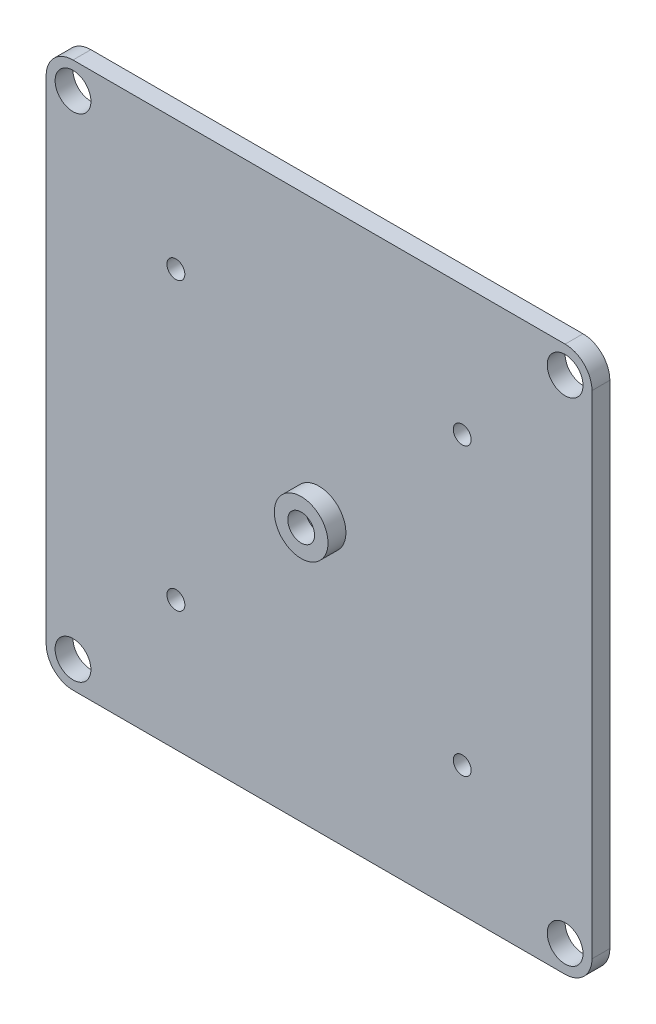
ISO-10303-21;
HEADER;
FILE_DESCRIPTION(('STEP AP214'),'2;1');
FILE_NAME('part.step','',(''),(''),'','','');
FILE_SCHEMA(('AUTOMOTIVE_DESIGN { 1 0 10303 214 1 1 1 1 }'));
ENDSEC;
DATA;
#1=APPLICATION_CONTEXT('core data for automotive mechanical design processes');
#2=APPLICATION_PROTOCOL_DEFINITION('international standard','automotive_design',2000,#1);
#3=PRODUCT_CONTEXT('',#1,'mechanical');
#4=PRODUCT('Part','Part','',(#3));
#5=PRODUCT_RELATED_PRODUCT_CATEGORY('part','',(#4));
#6=PRODUCT_DEFINITION_FORMATION('','',#4);
#7=PRODUCT_DEFINITION_CONTEXT('part definition',#1,'design');
#8=PRODUCT_DEFINITION('design','',#6,#7);
#9=PRODUCT_DEFINITION_SHAPE('','',#8);
#10=(LENGTH_UNIT() NAMED_UNIT(*) SI_UNIT(.MILLI.,.METRE.));
#11=(NAMED_UNIT(*) PLANE_ANGLE_UNIT() SI_UNIT($,.RADIAN.));
#12=(NAMED_UNIT(*) SI_UNIT($,.STERADIAN.) SOLID_ANGLE_UNIT());
#13=UNCERTAINTY_MEASURE_WITH_UNIT(LENGTH_MEASURE(1.E-05),#10,'distance_accuracy_value','');
#14=(GEOMETRIC_REPRESENTATION_CONTEXT(3) GLOBAL_UNCERTAINTY_ASSIGNED_CONTEXT((#13)) GLOBAL_UNIT_ASSIGNED_CONTEXT((#10,
#11,#12)) REPRESENTATION_CONTEXT('',''));
#15=CARTESIAN_POINT('',(0.,0.,0.));
#16=DIRECTION('',(0.,0.,1.));
#17=DIRECTION('',(1.,0.,0.));
#18=AXIS2_PLACEMENT_3D('',#15,#16,#17);
#19=CARTESIAN_POINT('',(-152.5,-152.5,10.));
#20=DIRECTION('',(1.,0.,0.));
#21=DIRECTION('',(0.,1.,0.));
#22=AXIS2_PLACEMENT_3D('',#19,#20,#21);
#23=PLANE('',#22);
#24=DIRECTION('',(0.,-1.,0.));
#25=VECTOR('',#24,1.);
#26=CARTESIAN_POINT('',(-152.5,-152.5,0.));
#27=LINE('',#26,#25);
#28=CARTESIAN_POINT('',(-152.5,137.5,0.));
#29=VERTEX_POINT('',#28);
#30=CARTESIAN_POINT('',(-152.5,-137.5,0.));
#31=VERTEX_POINT('',#30);
#32=EDGE_CURVE('E189',#29,#31,#27,.T.);
#33=ORIENTED_EDGE('',*,*,#32,.T.);
#34=DIRECTION('',(0.,0.,-1.));
#35=VECTOR('',#34,1.);
#36=CARTESIAN_POINT('',(-152.5,-137.5,10.));
#37=LINE('',#36,#35);
#38=CARTESIAN_POINT('',(-152.5,-137.5,10.));
#39=VERTEX_POINT('',#38);
#40=EDGE_CURVE('E50',#31,#39,#37,.F.);
#41=ORIENTED_EDGE('',*,*,#40,.T.);
#42=DIRECTION('',(0.,-1.,0.));
#43=VECTOR('',#42,1.);
#44=CARTESIAN_POINT('',(-152.5,-152.5,10.));
#45=LINE('',#44,#43);
#46=CARTESIAN_POINT('',(-152.5,137.5,10.));
#47=VERTEX_POINT('',#46);
#48=EDGE_CURVE('E138',#47,#39,#45,.T.);
#49=ORIENTED_EDGE('',*,*,#48,.F.);
#50=DIRECTION('',(0.,0.,-1.));
#51=VECTOR('',#50,1.);
#52=CARTESIAN_POINT('',(-152.5,137.5,10.));
#53=LINE('',#52,#51);
#54=EDGE_CURVE('E180',#47,#29,#53,.T.);
#55=ORIENTED_EDGE('',*,*,#54,.T.);
#56=EDGE_LOOP('',(#33,#41,#49,#55));
#57=FACE_BOUND('',#56,.T.);
#58=ADVANCED_FACE('F41',(#57),#23,.F.);
#59=CARTESIAN_POINT('',(-152.5,-152.5,10.));
#60=DIRECTION('',(0.,1.,0.));
#61=DIRECTION('',(0.,0.,1.));
#62=AXIS2_PLACEMENT_3D('',#59,#60,#61);
#63=PLANE('',#62);
#64=DIRECTION('',(1.,0.,0.));
#65=VECTOR('',#64,1.);
#66=CARTESIAN_POINT('',(-152.5,-152.5,0.));
#67=LINE('',#66,#65);
#68=CARTESIAN_POINT('',(-137.5,-152.5,0.));
#69=VERTEX_POINT('',#68);
#70=CARTESIAN_POINT('',(137.5,-152.5,0.));
#71=VERTEX_POINT('',#70);
#72=EDGE_CURVE('E145',#69,#71,#67,.T.);
#73=ORIENTED_EDGE('',*,*,#72,.T.);
#74=DIRECTION('',(0.,0.,-1.));
#75=VECTOR('',#74,1.);
#76=CARTESIAN_POINT('',(137.5,-152.5,10.));
#77=LINE('',#76,#75);
#78=CARTESIAN_POINT('',(137.5,-152.5,10.));
#79=VERTEX_POINT('',#78);
#80=EDGE_CURVE('E57',#71,#79,#77,.F.);
#81=ORIENTED_EDGE('',*,*,#80,.T.);
#82=DIRECTION('',(1.,0.,0.));
#83=VECTOR('',#82,1.);
#84=CARTESIAN_POINT('',(-152.5,-152.5,10.));
#85=LINE('',#84,#83);
#86=CARTESIAN_POINT('',(-137.5,-152.5,10.));
#87=VERTEX_POINT('',#86);
#88=EDGE_CURVE('E143',#87,#79,#85,.T.);
#89=ORIENTED_EDGE('',*,*,#88,.F.);
#90=DIRECTION('',(0.,0.,-1.));
#91=VECTOR('',#90,1.);
#92=CARTESIAN_POINT('',(-137.5,-152.5,10.));
#93=LINE('',#92,#91);
#94=EDGE_CURVE('E174',#87,#69,#93,.T.);
#95=ORIENTED_EDGE('',*,*,#94,.T.);
#96=EDGE_LOOP('',(#73,#81,#89,#95));
#97=FACE_BOUND('',#96,.T.);
#98=ADVANCED_FACE('F197',(#97),#63,.F.);
#99=CARTESIAN_POINT('',(152.5,-152.5,10.));
#100=DIRECTION('',(-1.,0.,0.));
#101=DIRECTION('',(0.,-1.,0.));
#102=AXIS2_PLACEMENT_3D('',#99,#100,#101);
#103=PLANE('',#102);
#104=DIRECTION('',(0.,1.,0.));
#105=VECTOR('',#104,1.);
#106=CARTESIAN_POINT('',(152.5,-152.5,0.));
#107=LINE('',#106,#105);
#108=CARTESIAN_POINT('',(152.5,-137.5,0.));
#109=VERTEX_POINT('',#108);
#110=CARTESIAN_POINT('',(152.5,137.5,0.));
#111=VERTEX_POINT('',#110);
#112=EDGE_CURVE('E139',#109,#111,#107,.T.);
#113=ORIENTED_EDGE('',*,*,#112,.T.);
#114=DIRECTION('',(0.,0.,-1.));
#115=VECTOR('',#114,1.);
#116=CARTESIAN_POINT('',(152.5,137.5,10.));
#117=LINE('',#116,#115);
#118=CARTESIAN_POINT('',(152.5,137.5,10.));
#119=VERTEX_POINT('',#118);
#120=EDGE_CURVE('E114',#111,#119,#117,.F.);
#121=ORIENTED_EDGE('',*,*,#120,.T.);
#122=DIRECTION('',(0.,1.,0.));
#123=VECTOR('',#122,1.);
#124=CARTESIAN_POINT('',(152.5,-152.5,10.));
#125=LINE('',#124,#123);
#126=CARTESIAN_POINT('',(152.5,-137.5,10.));
#127=VERTEX_POINT('',#126);
#128=EDGE_CURVE('E205',#127,#119,#125,.T.);
#129=ORIENTED_EDGE('',*,*,#128,.F.);
#130=DIRECTION('',(0.,0.,-1.));
#131=VECTOR('',#130,1.);
#132=CARTESIAN_POINT('',(152.5,-137.5,10.));
#133=LINE('',#132,#131);
#134=EDGE_CURVE('E120',#127,#109,#133,.T.);
#135=ORIENTED_EDGE('',*,*,#134,.T.);
#136=EDGE_LOOP('',(#113,#121,#129,#135));
#137=FACE_BOUND('',#136,.T.);
#138=ADVANCED_FACE('F347',(#137),#103,.F.);
#139=CARTESIAN_POINT('',(-152.5,152.5,10.));
#140=DIRECTION('',(0.,-1.,0.));
#141=DIRECTION('',(1.,0.,0.));
#142=AXIS2_PLACEMENT_3D('',#139,#140,#141);
#143=PLANE('',#142);
#144=DIRECTION('',(-1.,0.,0.));
#145=VECTOR('',#144,1.);
#146=CARTESIAN_POINT('',(-152.5,152.5,10.));
#147=LINE('',#146,#145);
#148=CARTESIAN_POINT('',(137.5,152.5,10.));
#149=VERTEX_POINT('',#148);
#150=CARTESIAN_POINT('',(-137.5,152.5,10.));
#151=VERTEX_POINT('',#150);
#152=EDGE_CURVE('E130',#149,#151,#147,.T.);
#153=ORIENTED_EDGE('',*,*,#152,.F.);
#154=DIRECTION('',(0.,0.,-1.));
#155=VECTOR('',#154,1.);
#156=CARTESIAN_POINT('',(137.5,152.5,10.));
#157=LINE('',#156,#155);
#158=CARTESIAN_POINT('',(137.5,152.5,0.));
#159=VERTEX_POINT('',#158);
#160=EDGE_CURVE('E113',#149,#159,#157,.T.);
#161=ORIENTED_EDGE('',*,*,#160,.T.);
#162=DIRECTION('',(-1.,0.,0.));
#163=VECTOR('',#162,1.);
#164=CARTESIAN_POINT('',(-152.5,152.5,0.));
#165=LINE('',#164,#163);
#166=CARTESIAN_POINT('',(-137.5,152.5,0.));
#167=VERTEX_POINT('',#166);
#168=EDGE_CURVE('E127',#159,#167,#165,.T.);
#169=ORIENTED_EDGE('',*,*,#168,.T.);
#170=DIRECTION('',(0.,0.,-1.));
#171=VECTOR('',#170,1.);
#172=CARTESIAN_POINT('',(-137.5,152.5,10.));
#173=LINE('',#172,#171);
#174=EDGE_CURVE('E133',#167,#151,#173,.F.);
#175=ORIENTED_EDGE('',*,*,#174,.T.);
#176=EDGE_LOOP('',(#153,#161,#169,#175));
#177=FACE_BOUND('',#176,.T.);
#178=ADVANCED_FACE('F126',(#177),#143,.F.);
#179=CARTESIAN_POINT('',(0.,0.,10.));
#180=DIRECTION('',(0.,0.,-1.));
#181=DIRECTION('',(-1.,0.,0.));
#182=AXIS2_PLACEMENT_3D('',#179,#180,#181);
#183=PLANE('',#182);
#184=CARTESIAN_POINT('',(0.,0.,10.));
#185=DIRECTION('',(0.,0.,-1.));
#186=DIRECTION('',(-1.,0.,0.));
#187=AXIS2_PLACEMENT_3D('',#184,#185,#186);
#188=CIRCLE('',#187,15.);
#189=CARTESIAN_POINT('',(-15.,0.,10.));
#190=VERTEX_POINT('',#189);
#191=EDGE_CURVE('E11',#190,#190,#188,.F.);
#192=ORIENTED_EDGE('',*,*,#191,.F.);
#193=EDGE_LOOP('',(#192));
#194=FACE_BOUND('',#193,.T.);
#195=CARTESIAN_POINT('',(-80.,80.,10.));
#196=DIRECTION('',(0.,0.,1.));
#197=DIRECTION('',(1.,0.,0.));
#198=AXIS2_PLACEMENT_3D('',#195,#196,#197);
#199=CIRCLE('',#198,5.00000000000001);
#200=CARTESIAN_POINT('',(-75.,80.,10.));
#201=VERTEX_POINT('',#200);
#202=EDGE_CURVE('E250',#201,#201,#199,.T.);
#203=ORIENTED_EDGE('',*,*,#202,.F.);
#204=EDGE_LOOP('',(#203));
#205=FACE_BOUND('',#204,.T.);
#206=CARTESIAN_POINT('',(-80.,-80.,10.));
#207=DIRECTION('',(0.,0.,1.));
#208=DIRECTION('',(1.,0.,0.));
#209=AXIS2_PLACEMENT_3D('',#206,#207,#208);
#210=CIRCLE('',#209,5.00000000000001);
#211=CARTESIAN_POINT('',(-75.,-80.,10.));
#212=VERTEX_POINT('',#211);
#213=EDGE_CURVE('E259',#212,#212,#210,.T.);
#214=ORIENTED_EDGE('',*,*,#213,.F.);
#215=EDGE_LOOP('',(#214));
#216=FACE_BOUND('',#215,.T.);
#217=CARTESIAN_POINT('',(80.,-80.,10.));
#218=DIRECTION('',(0.,0.,1.));
#219=DIRECTION('',(1.,0.,0.));
#220=AXIS2_PLACEMENT_3D('',#217,#218,#219);
#221=CIRCLE('',#220,5.00000000000001);
#222=CARTESIAN_POINT('',(85.,-80.,10.));
#223=VERTEX_POINT('',#222);
#224=EDGE_CURVE('E267',#223,#223,#221,.T.);
#225=ORIENTED_EDGE('',*,*,#224,.F.);
#226=EDGE_LOOP('',(#225));
#227=FACE_BOUND('',#226,.T.);
#228=CARTESIAN_POINT('',(80.,80.,10.));
#229=DIRECTION('',(0.,0.,1.));
#230=DIRECTION('',(1.,0.,0.));
#231=AXIS2_PLACEMENT_3D('',#228,#229,#230);
#232=CIRCLE('',#231,5.00000000000001);
#233=CARTESIAN_POINT('',(85.,80.,10.));
#234=VERTEX_POINT('',#233);
#235=EDGE_CURVE('E242',#234,#234,#232,.T.);
#236=ORIENTED_EDGE('',*,*,#235,.F.);
#237=EDGE_LOOP('',(#236));
#238=FACE_BOUND('',#237,.T.);
#239=CARTESIAN_POINT('',(-137.5,137.5,10.));
#240=DIRECTION('',(0.,0.,1.));
#241=DIRECTION('',(1.,0.,0.));
#242=AXIS2_PLACEMENT_3D('',#239,#240,#241);
#243=CIRCLE('',#242,10.);
#244=CARTESIAN_POINT('',(-127.5,137.5,10.));
#245=VERTEX_POINT('',#244);
#246=EDGE_CURVE('E218',#245,#245,#243,.T.);
#247=ORIENTED_EDGE('',*,*,#246,.F.);
#248=EDGE_LOOP('',(#247));
#249=FACE_BOUND('',#248,.T.);
#250=CARTESIAN_POINT('',(-137.5,-137.5,10.));
#251=DIRECTION('',(0.,0.,1.));
#252=DIRECTION('',(1.,0.,0.));
#253=AXIS2_PLACEMENT_3D('',#250,#251,#252);
#254=CIRCLE('',#253,10.);
#255=CARTESIAN_POINT('',(-127.5,-137.5,10.));
#256=VERTEX_POINT('',#255);
#257=EDGE_CURVE('E227',#256,#256,#254,.T.);
#258=ORIENTED_EDGE('',*,*,#257,.F.);
#259=EDGE_LOOP('',(#258));
#260=FACE_BOUND('',#259,.T.);
#261=CARTESIAN_POINT('',(137.5,-137.5,10.));
#262=DIRECTION('',(0.,0.,1.));
#263=DIRECTION('',(1.,0.,0.));
#264=AXIS2_PLACEMENT_3D('',#261,#262,#263);
#265=CIRCLE('',#264,10.);
#266=CARTESIAN_POINT('',(147.5,-137.5,10.));
#267=VERTEX_POINT('',#266);
#268=EDGE_CURVE('E235',#267,#267,#265,.T.);
#269=ORIENTED_EDGE('',*,*,#268,.F.);
#270=EDGE_LOOP('',(#269));
#271=FACE_BOUND('',#270,.T.);
#272=CARTESIAN_POINT('',(137.5,137.5,10.));
#273=DIRECTION('',(0.,0.,1.));
#274=DIRECTION('',(1.,0.,0.));
#275=AXIS2_PLACEMENT_3D('',#272,#273,#274);
#276=CIRCLE('',#275,10.);
#277=CARTESIAN_POINT('',(147.5,137.5,10.));
#278=VERTEX_POINT('',#277);
#279=EDGE_CURVE('E210',#278,#278,#276,.T.);
#280=ORIENTED_EDGE('',*,*,#279,.F.);
#281=EDGE_LOOP('',(#280));
#282=FACE_BOUND('',#281,.T.);
#283=ORIENTED_EDGE('',*,*,#128,.T.);
#284=CARTESIAN_POINT('',(137.5,137.5,10.));
#285=DIRECTION('',(0.,0.,-1.));
#286=DIRECTION('',(-1.,0.,0.));
#287=AXIS2_PLACEMENT_3D('',#284,#285,#286);
#288=CIRCLE('',#287,15.);
#289=EDGE_CURVE('E171',#119,#149,#288,.F.);
#290=ORIENTED_EDGE('',*,*,#289,.T.);
#291=ORIENTED_EDGE('',*,*,#152,.T.);
#292=CARTESIAN_POINT('',(-137.5,137.5,10.));
#293=DIRECTION('',(0.,0.,-1.));
#294=DIRECTION('',(-1.,0.,0.));
#295=AXIS2_PLACEMENT_3D('',#292,#293,#294);
#296=CIRCLE('',#295,15.);
#297=EDGE_CURVE('E163',#151,#47,#296,.F.);
#298=ORIENTED_EDGE('',*,*,#297,.T.);
#299=ORIENTED_EDGE('',*,*,#48,.T.);
#300=CARTESIAN_POINT('',(-137.5,-137.5,10.));
#301=DIRECTION('',(0.,0.,-1.));
#302=DIRECTION('',(-1.,0.,0.));
#303=AXIS2_PLACEMENT_3D('',#300,#301,#302);
#304=CIRCLE('',#303,15.);
#305=EDGE_CURVE('E64',#39,#87,#304,.F.);
#306=ORIENTED_EDGE('',*,*,#305,.T.);
#307=ORIENTED_EDGE('',*,*,#88,.T.);
#308=CARTESIAN_POINT('',(137.5,-137.5,10.));
#309=DIRECTION('',(0.,0.,-1.));
#310=DIRECTION('',(-1.,0.,0.));
#311=AXIS2_PLACEMENT_3D('',#308,#309,#310);
#312=CIRCLE('',#311,15.);
#313=EDGE_CURVE('E168',#79,#127,#312,.F.);
#314=ORIENTED_EDGE('',*,*,#313,.T.);
#315=EDGE_LOOP('',(#283,#290,#291,#298,#299,#306,#307,#314));
#316=FACE_BOUND('',#315,.T.);
#317=ADVANCED_FACE('F192',(#194,#205,#216,#227,#238,#249,#260,#271,#282,#316),#183,.F.);
#318=CARTESIAN_POINT('',(0.,0.,0.));
#319=DIRECTION('',(0.,0.,-1.));
#320=DIRECTION('',(-1.,0.,0.));
#321=AXIS2_PLACEMENT_3D('',#318,#319,#320);
#322=PLANE('',#321);
#323=CARTESIAN_POINT('',(-80.,80.,0.));
#324=DIRECTION('',(0.,0.,1.));
#325=DIRECTION('',(1.,0.,0.));
#326=AXIS2_PLACEMENT_3D('',#323,#324,#325);
#327=CIRCLE('',#326,5.00000000000001);
#328=CARTESIAN_POINT('',(-75.,80.,0.));
#329=VERTEX_POINT('',#328);
#330=EDGE_CURVE('E254',#329,#329,#327,.T.);
#331=ORIENTED_EDGE('',*,*,#330,.T.);
#332=EDGE_LOOP('',(#331));
#333=FACE_BOUND('',#332,.T.);
#334=CARTESIAN_POINT('',(-80.,-80.,0.));
#335=DIRECTION('',(0.,0.,1.));
#336=DIRECTION('',(1.,0.,0.));
#337=AXIS2_PLACEMENT_3D('',#334,#335,#336);
#338=CIRCLE('',#337,5.00000000000001);
#339=CARTESIAN_POINT('',(-75.,-80.,0.));
#340=VERTEX_POINT('',#339);
#341=EDGE_CURVE('E263',#340,#340,#338,.T.);
#342=ORIENTED_EDGE('',*,*,#341,.T.);
#343=EDGE_LOOP('',(#342));
#344=FACE_BOUND('',#343,.T.);
#345=CARTESIAN_POINT('',(80.,-80.,0.));
#346=DIRECTION('',(0.,0.,1.));
#347=DIRECTION('',(1.,0.,0.));
#348=AXIS2_PLACEMENT_3D('',#345,#346,#347);
#349=CIRCLE('',#348,5.00000000000001);
#350=CARTESIAN_POINT('',(85.,-80.,0.));
#351=VERTEX_POINT('',#350);
#352=EDGE_CURVE('E246',#351,#351,#349,.T.);
#353=ORIENTED_EDGE('',*,*,#352,.T.);
#354=EDGE_LOOP('',(#353));
#355=FACE_BOUND('',#354,.T.);
#356=CARTESIAN_POINT('',(80.,80.,0.));
#357=DIRECTION('',(0.,0.,1.));
#358=DIRECTION('',(1.,0.,0.));
#359=AXIS2_PLACEMENT_3D('',#356,#357,#358);
#360=CIRCLE('',#359,5.00000000000001);
#361=CARTESIAN_POINT('',(85.,80.,0.));
#362=VERTEX_POINT('',#361);
#363=EDGE_CURVE('E223',#362,#362,#360,.T.);
#364=ORIENTED_EDGE('',*,*,#363,.T.);
#365=EDGE_LOOP('',(#364));
#366=FACE_BOUND('',#365,.T.);
#367=CARTESIAN_POINT('',(-137.5,137.5,0.));
#368=DIRECTION('',(0.,0.,1.));
#369=DIRECTION('',(1.,0.,0.));
#370=AXIS2_PLACEMENT_3D('',#367,#368,#369);
#371=CIRCLE('',#370,10.);
#372=CARTESIAN_POINT('',(-127.5,137.5,0.));
#373=VERTEX_POINT('',#372);
#374=EDGE_CURVE('E222',#373,#373,#371,.T.);
#375=ORIENTED_EDGE('',*,*,#374,.T.);
#376=EDGE_LOOP('',(#375));
#377=FACE_BOUND('',#376,.T.);
#378=CARTESIAN_POINT('',(-137.5,-137.5,0.));
#379=DIRECTION('',(0.,0.,1.));
#380=DIRECTION('',(1.,0.,0.));
#381=AXIS2_PLACEMENT_3D('',#378,#379,#380);
#382=CIRCLE('',#381,10.);
#383=CARTESIAN_POINT('',(-127.5,-137.5,0.));
#384=VERTEX_POINT('',#383);
#385=EDGE_CURVE('E231',#384,#384,#382,.T.);
#386=ORIENTED_EDGE('',*,*,#385,.T.);
#387=EDGE_LOOP('',(#386));
#388=FACE_BOUND('',#387,.T.);
#389=CARTESIAN_POINT('',(137.5,-137.5,0.));
#390=DIRECTION('',(0.,0.,1.));
#391=DIRECTION('',(1.,0.,0.));
#392=AXIS2_PLACEMENT_3D('',#389,#390,#391);
#393=CIRCLE('',#392,10.);
#394=CARTESIAN_POINT('',(147.5,-137.5,0.));
#395=VERTEX_POINT('',#394);
#396=EDGE_CURVE('E214',#395,#395,#393,.T.);
#397=ORIENTED_EDGE('',*,*,#396,.T.);
#398=EDGE_LOOP('',(#397));
#399=FACE_BOUND('',#398,.T.);
#400=CARTESIAN_POINT('',(137.5,137.5,0.));
#401=DIRECTION('',(0.,0.,1.));
#402=DIRECTION('',(1.,0.,0.));
#403=AXIS2_PLACEMENT_3D('',#400,#401,#402);
#404=CIRCLE('',#403,10.);
#405=CARTESIAN_POINT('',(147.5,137.5,0.));
#406=VERTEX_POINT('',#405);
#407=EDGE_CURVE('E200',#406,#406,#404,.T.);
#408=ORIENTED_EDGE('',*,*,#407,.T.);
#409=EDGE_LOOP('',(#408));
#410=FACE_BOUND('',#409,.T.);
#411=ORIENTED_EDGE('',*,*,#168,.F.);
#412=CARTESIAN_POINT('',(137.5,137.5,0.));
#413=DIRECTION('',(0.,0.,-1.));
#414=DIRECTION('',(-1.,0.,0.));
#415=AXIS2_PLACEMENT_3D('',#412,#413,#414);
#416=CIRCLE('',#415,15.);
#417=EDGE_CURVE('E109',#159,#111,#416,.T.);
#418=ORIENTED_EDGE('',*,*,#417,.T.);
#419=ORIENTED_EDGE('',*,*,#112,.F.);
#420=CARTESIAN_POINT('',(137.5,-137.5,0.));
#421=DIRECTION('',(0.,0.,-1.));
#422=DIRECTION('',(-1.,0.,0.));
#423=AXIS2_PLACEMENT_3D('',#420,#421,#422);
#424=CIRCLE('',#423,15.);
#425=EDGE_CURVE('E121',#109,#71,#424,.T.);
#426=ORIENTED_EDGE('',*,*,#425,.T.);
#427=ORIENTED_EDGE('',*,*,#72,.F.);
#428=CARTESIAN_POINT('',(-137.5,-137.5,0.));
#429=DIRECTION('',(0.,0.,-1.));
#430=DIRECTION('',(-1.,0.,0.));
#431=AXIS2_PLACEMENT_3D('',#428,#429,#430);
#432=CIRCLE('',#431,15.);
#433=EDGE_CURVE('E153',#69,#31,#432,.T.);
#434=ORIENTED_EDGE('',*,*,#433,.T.);
#435=ORIENTED_EDGE('',*,*,#32,.F.);
#436=CARTESIAN_POINT('',(-137.5,137.5,0.));
#437=DIRECTION('',(0.,0.,-1.));
#438=DIRECTION('',(-1.,0.,0.));
#439=AXIS2_PLACEMENT_3D('',#436,#437,#438);
#440=CIRCLE('',#439,15.);
#441=EDGE_CURVE('E132',#29,#167,#440,.T.);
#442=ORIENTED_EDGE('',*,*,#441,.T.);
#443=EDGE_LOOP('',(#411,#418,#419,#426,#427,#434,#435,#442));
#444=FACE_BOUND('',#443,.T.);
#445=ADVANCED_FACE('F135',(#333,#344,#355,#366,#377,#388,#399,#410,#444),#322,.T.);
#446=CARTESIAN_POINT('',(137.5,137.5,0.));
#447=DIRECTION('',(0.,0.,1.));
#448=DIRECTION('',(1.,0.,0.));
#449=AXIS2_PLACEMENT_3D('',#446,#447,#448);
#450=CYLINDRICAL_SURFACE('',#449,10.);
#451=ORIENTED_EDGE('',*,*,#407,.F.);
#452=EDGE_LOOP('',(#451));
#453=FACE_BOUND('',#452,.T.);
#454=ORIENTED_EDGE('',*,*,#279,.T.);
#455=EDGE_LOOP('',(#454));
#456=FACE_BOUND('',#455,.T.);
#457=ADVANCED_FACE('F326',(#453,#456),#450,.F.);
#458=CARTESIAN_POINT('',(137.5,-137.5,0.));
#459=DIRECTION('',(0.,0.,1.));
#460=DIRECTION('',(1.,0.,0.));
#461=AXIS2_PLACEMENT_3D('',#458,#459,#460);
#462=CYLINDRICAL_SURFACE('',#461,10.);
#463=ORIENTED_EDGE('',*,*,#396,.F.);
#464=EDGE_LOOP('',(#463));
#465=FACE_BOUND('',#464,.T.);
#466=ORIENTED_EDGE('',*,*,#268,.T.);
#467=EDGE_LOOP('',(#466));
#468=FACE_BOUND('',#467,.T.);
#469=ADVANCED_FACE('F328',(#465,#468),#462,.F.);
#470=CARTESIAN_POINT('',(-137.5,-137.5,0.));
#471=DIRECTION('',(0.,0.,1.));
#472=DIRECTION('',(1.,0.,0.));
#473=AXIS2_PLACEMENT_3D('',#470,#471,#472);
#474=CYLINDRICAL_SURFACE('',#473,10.);
#475=ORIENTED_EDGE('',*,*,#385,.F.);
#476=EDGE_LOOP('',(#475));
#477=FACE_BOUND('',#476,.T.);
#478=ORIENTED_EDGE('',*,*,#257,.T.);
#479=EDGE_LOOP('',(#478));
#480=FACE_BOUND('',#479,.T.);
#481=ADVANCED_FACE('F335',(#477,#480),#474,.F.);
#482=CARTESIAN_POINT('',(-137.5,137.5,0.));
#483=DIRECTION('',(0.,0.,1.));
#484=DIRECTION('',(1.,0.,0.));
#485=AXIS2_PLACEMENT_3D('',#482,#483,#484);
#486=CYLINDRICAL_SURFACE('',#485,10.);
#487=ORIENTED_EDGE('',*,*,#374,.F.);
#488=EDGE_LOOP('',(#487));
#489=FACE_BOUND('',#488,.T.);
#490=ORIENTED_EDGE('',*,*,#246,.T.);
#491=EDGE_LOOP('',(#490));
#492=FACE_BOUND('',#491,.T.);
#493=ADVANCED_FACE('F354',(#489,#492),#486,.F.);
#494=CARTESIAN_POINT('',(137.5,137.5,10.));
#495=DIRECTION('',(0.,0.,-1.));
#496=DIRECTION('',(-1.,0.,0.));
#497=AXIS2_PLACEMENT_3D('',#494,#495,#496);
#498=CYLINDRICAL_SURFACE('',#497,15.);
#499=ORIENTED_EDGE('',*,*,#289,.F.);
#500=ORIENTED_EDGE('',*,*,#120,.F.);
#501=ORIENTED_EDGE('',*,*,#417,.F.);
#502=ORIENTED_EDGE('',*,*,#160,.F.);
#503=EDGE_LOOP('',(#499,#500,#501,#502));
#504=FACE_BOUND('',#503,.T.);
#505=ADVANCED_FACE('F112',(#504),#498,.T.);
#506=CARTESIAN_POINT('',(137.5,-137.5,10.));
#507=DIRECTION('',(0.,0.,-1.));
#508=DIRECTION('',(-1.,0.,0.));
#509=AXIS2_PLACEMENT_3D('',#506,#507,#508);
#510=CYLINDRICAL_SURFACE('',#509,15.);
#511=ORIENTED_EDGE('',*,*,#313,.F.);
#512=ORIENTED_EDGE('',*,*,#80,.F.);
#513=ORIENTED_EDGE('',*,*,#425,.F.);
#514=ORIENTED_EDGE('',*,*,#134,.F.);
#515=EDGE_LOOP('',(#511,#512,#513,#514));
#516=FACE_BOUND('',#515,.T.);
#517=ADVANCED_FACE('F353',(#516),#510,.T.);
#518=CARTESIAN_POINT('',(-137.5,-137.5,10.));
#519=DIRECTION('',(0.,0.,-1.));
#520=DIRECTION('',(-1.,0.,0.));
#521=AXIS2_PLACEMENT_3D('',#518,#519,#520);
#522=CYLINDRICAL_SURFACE('',#521,15.);
#523=ORIENTED_EDGE('',*,*,#305,.F.);
#524=ORIENTED_EDGE('',*,*,#40,.F.);
#525=ORIENTED_EDGE('',*,*,#433,.F.);
#526=ORIENTED_EDGE('',*,*,#94,.F.);
#527=EDGE_LOOP('',(#523,#524,#525,#526));
#528=FACE_BOUND('',#527,.T.);
#529=ADVANCED_FACE('F195',(#528),#522,.T.);
#530=CARTESIAN_POINT('',(-137.5,137.5,10.));
#531=DIRECTION('',(0.,0.,-1.));
#532=DIRECTION('',(-1.,0.,0.));
#533=AXIS2_PLACEMENT_3D('',#530,#531,#532);
#534=CYLINDRICAL_SURFACE('',#533,15.);
#535=ORIENTED_EDGE('',*,*,#297,.F.);
#536=ORIENTED_EDGE('',*,*,#174,.F.);
#537=ORIENTED_EDGE('',*,*,#441,.F.);
#538=ORIENTED_EDGE('',*,*,#54,.F.);
#539=EDGE_LOOP('',(#535,#536,#537,#538));
#540=FACE_BOUND('',#539,.T.);
#541=ADVANCED_FACE('F43',(#540),#534,.T.);
#542=CARTESIAN_POINT('',(80.,80.,0.));
#543=DIRECTION('',(0.,0.,1.));
#544=DIRECTION('',(1.,0.,0.));
#545=AXIS2_PLACEMENT_3D('',#542,#543,#544);
#546=CYLINDRICAL_SURFACE('',#545,5.00000000000001);
#547=ORIENTED_EDGE('',*,*,#363,.F.);
#548=EDGE_LOOP('',(#547));
#549=FACE_BOUND('',#548,.T.);
#550=ORIENTED_EDGE('',*,*,#235,.T.);
#551=EDGE_LOOP('',(#550));
#552=FACE_BOUND('',#551,.T.);
#553=ADVANCED_FACE('F361',(#549,#552),#546,.F.);
#554=CARTESIAN_POINT('',(80.,-80.,0.));
#555=DIRECTION('',(0.,0.,1.));
#556=DIRECTION('',(1.,0.,0.));
#557=AXIS2_PLACEMENT_3D('',#554,#555,#556);
#558=CYLINDRICAL_SURFACE('',#557,5.00000000000001);
#559=ORIENTED_EDGE('',*,*,#352,.F.);
#560=EDGE_LOOP('',(#559));
#561=FACE_BOUND('',#560,.T.);
#562=ORIENTED_EDGE('',*,*,#224,.T.);
#563=EDGE_LOOP('',(#562));
#564=FACE_BOUND('',#563,.T.);
#565=ADVANCED_FACE('F366',(#561,#564),#558,.F.);
#566=CARTESIAN_POINT('',(-80.,-80.,0.));
#567=DIRECTION('',(0.,0.,1.));
#568=DIRECTION('',(1.,0.,0.));
#569=AXIS2_PLACEMENT_3D('',#566,#567,#568);
#570=CYLINDRICAL_SURFACE('',#569,5.00000000000001);
#571=ORIENTED_EDGE('',*,*,#341,.F.);
#572=EDGE_LOOP('',(#571));
#573=FACE_BOUND('',#572,.T.);
#574=ORIENTED_EDGE('',*,*,#213,.T.);
#575=EDGE_LOOP('',(#574));
#576=FACE_BOUND('',#575,.T.);
#577=ADVANCED_FACE('F409',(#573,#576),#570,.F.);
#578=CARTESIAN_POINT('',(-80.,80.,0.));
#579=DIRECTION('',(0.,0.,1.));
#580=DIRECTION('',(1.,0.,0.));
#581=AXIS2_PLACEMENT_3D('',#578,#579,#580);
#582=CYLINDRICAL_SURFACE('',#581,5.00000000000001);
#583=ORIENTED_EDGE('',*,*,#330,.F.);
#584=EDGE_LOOP('',(#583));
#585=FACE_BOUND('',#584,.T.);
#586=ORIENTED_EDGE('',*,*,#202,.T.);
#587=EDGE_LOOP('',(#586));
#588=FACE_BOUND('',#587,.T.);
#589=ADVANCED_FACE('F303',(#585,#588),#582,.F.);
#590=CARTESIAN_POINT('',(0.,0.,20.));
#591=DIRECTION('',(0.,0.,-1.));
#592=DIRECTION('',(-1.,0.,0.));
#593=AXIS2_PLACEMENT_3D('',#590,#591,#592);
#594=CYLINDRICAL_SURFACE('',#593,15.);
#595=CARTESIAN_POINT('',(0.,0.,20.));
#596=DIRECTION('',(0.,0.,1.));
#597=DIRECTION('',(1.,0.,0.));
#598=AXIS2_PLACEMENT_3D('',#595,#596,#597);
#599=CIRCLE('',#598,15.);
#600=CARTESIAN_POINT('',(15.,0.,20.));
#601=VERTEX_POINT('',#600);
#602=EDGE_CURVE('E255',#601,#601,#599,.T.);
#603=ORIENTED_EDGE('',*,*,#602,.F.);
#604=EDGE_LOOP('',(#603));
#605=FACE_BOUND('',#604,.T.);
#606=ORIENTED_EDGE('',*,*,#191,.T.);
#607=EDGE_LOOP('',(#606));
#608=FACE_BOUND('',#607,.T.);
#609=ADVANCED_FACE('F297',(#605,#608),#594,.T.);
#610=CARTESIAN_POINT('',(0.,0.,20.));
#611=DIRECTION('',(0.,0.,1.));
#612=DIRECTION('',(1.,0.,0.));
#613=AXIS2_PLACEMENT_3D('',#610,#611,#612);
#614=PLANE('',#613);
#615=CARTESIAN_POINT('',(0.,0.,20.));
#616=DIRECTION('',(0.,0.,1.));
#617=DIRECTION('',(1.,0.,0.));
#618=AXIS2_PLACEMENT_3D('',#615,#616,#617);
#619=CIRCLE('',#618,7.5);
#620=CARTESIAN_POINT('',(7.5,0.,20.));
#621=VERTEX_POINT('',#620);
#622=EDGE_CURVE('E278',#621,#621,#619,.T.);
#623=ORIENTED_EDGE('',*,*,#622,.F.);
#624=EDGE_LOOP('',(#623));
#625=FACE_BOUND('',#624,.T.);
#626=ORIENTED_EDGE('',*,*,#602,.T.);
#627=EDGE_LOOP('',(#626));
#628=FACE_BOUND('',#627,.T.);
#629=ADVANCED_FACE('F291',(#625,#628),#614,.T.);
#630=CARTESIAN_POINT('',(0.,0.,10.));
#631=DIRECTION('',(0.,0.,1.));
#632=DIRECTION('',(1.,0.,0.));
#633=AXIS2_PLACEMENT_3D('',#630,#631,#632);
#634=CYLINDRICAL_SURFACE('',#633,7.5);
#635=CARTESIAN_POINT('',(0.,0.,10.));
#636=DIRECTION('',(0.,0.,1.));
#637=DIRECTION('',(1.,0.,0.));
#638=AXIS2_PLACEMENT_3D('',#635,#636,#637);
#639=CIRCLE('',#638,7.5);
#640=CARTESIAN_POINT('',(7.5,0.,10.));
#641=VERTEX_POINT('',#640);
#642=EDGE_CURVE('E277',#641,#641,#639,.T.);
#643=ORIENTED_EDGE('',*,*,#642,.F.);
#644=EDGE_LOOP('',(#643));
#645=FACE_BOUND('',#644,.T.);
#646=ORIENTED_EDGE('',*,*,#622,.T.);
#647=EDGE_LOOP('',(#646));
#648=FACE_BOUND('',#647,.T.);
#649=ADVANCED_FACE('F288',(#645,#648),#634,.F.);
#650=CARTESIAN_POINT('',(0.,0.,10.));
#651=DIRECTION('',(0.,0.,1.));
#652=DIRECTION('',(1.,0.,0.));
#653=AXIS2_PLACEMENT_3D('',#650,#651,#652);
#654=PLANE('',#653);
#655=ORIENTED_EDGE('',*,*,#642,.T.);
#656=EDGE_LOOP('',(#655));
#657=FACE_BOUND('',#656,.T.);
#658=ADVANCED_FACE('F286',(#657),#654,.T.);
#659=CLOSED_SHELL('',(#58,#98,#138,#178,#317,#445,#457,#469,#481,#493,#505,#517,#529,#541,#553,
#565,#577,#589,#609,#629,#649,#658));
#660=MANIFOLD_SOLID_BREP('B2',#659);
#661=ADVANCED_BREP_SHAPE_REPRESENTATION('',(#18,#660),#14);
#662=SHAPE_DEFINITION_REPRESENTATION(#9,#661);
ENDSEC;
END-ISO-10303-21;
